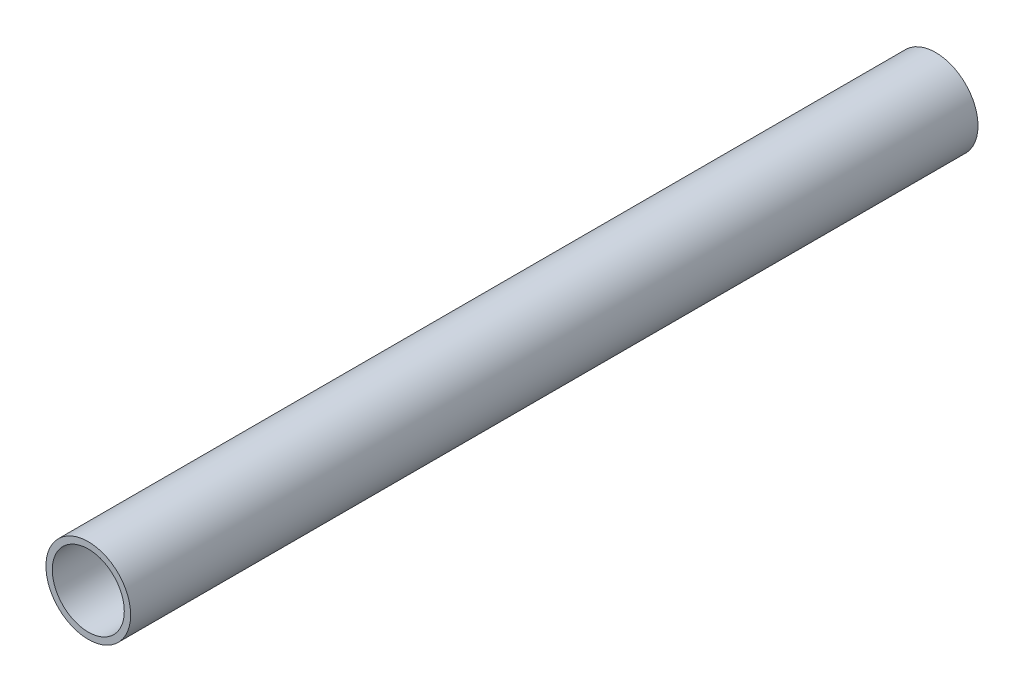
ISO-10303-21;
HEADER;
FILE_DESCRIPTION(('STEP AP214'),'2;1');
FILE_NAME('part.step','',(''),(''),'','','');
FILE_SCHEMA(('AUTOMOTIVE_DESIGN { 1 0 10303 214 1 1 1 1 }'));
ENDSEC;
DATA;
#1=APPLICATION_CONTEXT('core data for automotive mechanical design processes');
#2=APPLICATION_PROTOCOL_DEFINITION('international standard','automotive_design',2000,#1);
#3=PRODUCT_CONTEXT('',#1,'mechanical');
#4=PRODUCT('Part','Part','',(#3));
#5=PRODUCT_RELATED_PRODUCT_CATEGORY('part','',(#4));
#6=PRODUCT_DEFINITION_FORMATION('','',#4);
#7=PRODUCT_DEFINITION_CONTEXT('part definition',#1,'design');
#8=PRODUCT_DEFINITION('design','',#6,#7);
#9=PRODUCT_DEFINITION_SHAPE('','',#8);
#10=(LENGTH_UNIT() NAMED_UNIT(*) SI_UNIT(.MILLI.,.METRE.));
#11=(NAMED_UNIT(*) PLANE_ANGLE_UNIT() SI_UNIT($,.RADIAN.));
#12=(NAMED_UNIT(*) SI_UNIT($,.STERADIAN.) SOLID_ANGLE_UNIT());
#13=UNCERTAINTY_MEASURE_WITH_UNIT(LENGTH_MEASURE(1.E-05),#10,'distance_accuracy_value','');
#14=(GEOMETRIC_REPRESENTATION_CONTEXT(3) GLOBAL_UNCERTAINTY_ASSIGNED_CONTEXT((#13)) GLOBAL_UNIT_ASSIGNED_CONTEXT((#10,
#11,#12)) REPRESENTATION_CONTEXT('',''));
#15=CARTESIAN_POINT('',(0.,0.,0.));
#16=DIRECTION('',(0.,0.,1.));
#17=DIRECTION('',(1.,0.,0.));
#18=AXIS2_PLACEMENT_3D('',#15,#16,#17);
#19=CARTESIAN_POINT('',(0.,0.,200.));
#20=DIRECTION('',(0.,0.,1.));
#21=DIRECTION('',(1.,0.,0.));
#22=AXIS2_PLACEMENT_3D('',#19,#20,#21);
#23=PLANE('',#22);
#24=CARTESIAN_POINT('',(0.,0.,200.));
#25=DIRECTION('',(0.,0.,1.));
#26=DIRECTION('',(1.,0.,0.));
#27=AXIS2_PLACEMENT_3D('',#24,#25,#26);
#28=CIRCLE('',#27,10.);
#29=CARTESIAN_POINT('',(10.,0.,200.));
#30=VERTEX_POINT('',#29);
#31=EDGE_CURVE('E10',#30,#30,#28,.T.);
#32=ORIENTED_EDGE('',*,*,#31,.T.);
#33=EDGE_LOOP('',(#32));
#34=FACE_BOUND('',#33,.T.);
#35=CARTESIAN_POINT('',(0.,0.,200.));
#36=DIRECTION('',(0.,0.,1.));
#37=DIRECTION('',(1.,0.,0.));
#38=AXIS2_PLACEMENT_3D('',#35,#36,#37);
#39=CIRCLE('',#38,8.5);
#40=CARTESIAN_POINT('',(8.5,0.,200.));
#41=VERTEX_POINT('',#40);
#42=EDGE_CURVE('E50',#41,#41,#39,.T.);
#43=ORIENTED_EDGE('',*,*,#42,.F.);
#44=EDGE_LOOP('',(#43));
#45=FACE_BOUND('',#44,.T.);
#46=ADVANCED_FACE('F37',(#34,#45),#23,.T.);
#47=CARTESIAN_POINT('',(0.,0.,0.));
#48=DIRECTION('',(0.,0.,1.));
#49=DIRECTION('',(1.,0.,0.));
#50=AXIS2_PLACEMENT_3D('',#47,#48,#49);
#51=PLANE('',#50);
#52=CARTESIAN_POINT('',(0.,0.,0.));
#53=DIRECTION('',(0.,0.,1.));
#54=DIRECTION('',(1.,0.,0.));
#55=AXIS2_PLACEMENT_3D('',#52,#53,#54);
#56=CIRCLE('',#55,10.);
#57=CARTESIAN_POINT('',(10.,0.,0.));
#58=VERTEX_POINT('',#57);
#59=EDGE_CURVE('E41',#58,#58,#56,.T.);
#60=ORIENTED_EDGE('',*,*,#59,.F.);
#61=EDGE_LOOP('',(#60));
#62=FACE_BOUND('',#61,.T.);
#63=CARTESIAN_POINT('',(0.,0.,0.));
#64=DIRECTION('',(0.,0.,1.));
#65=DIRECTION('',(1.,0.,0.));
#66=AXIS2_PLACEMENT_3D('',#63,#64,#65);
#67=CIRCLE('',#66,8.5);
#68=CARTESIAN_POINT('',(8.5,0.,0.));
#69=VERTEX_POINT('',#68);
#70=EDGE_CURVE('E52',#69,#69,#67,.T.);
#71=ORIENTED_EDGE('',*,*,#70,.T.);
#72=EDGE_LOOP('',(#71));
#73=FACE_BOUND('',#72,.T.);
#74=ADVANCED_FACE('F64',(#62,#73),#51,.F.);
#75=CARTESIAN_POINT('',(0.,0.,200.));
#76=DIRECTION('',(0.,0.,-1.));
#77=DIRECTION('',(-1.,0.,0.));
#78=AXIS2_PLACEMENT_3D('',#75,#76,#77);
#79=CYLINDRICAL_SURFACE('',#78,10.);
#80=ORIENTED_EDGE('',*,*,#31,.F.);
#81=EDGE_LOOP('',(#80));
#82=FACE_BOUND('',#81,.T.);
#83=ORIENTED_EDGE('',*,*,#59,.T.);
#84=EDGE_LOOP('',(#83));
#85=FACE_BOUND('',#84,.T.);
#86=ADVANCED_FACE('F39',(#82,#85),#79,.T.);
#87=CARTESIAN_POINT('',(0.,0.,200.));
#88=DIRECTION('',(0.,0.,-1.));
#89=DIRECTION('',(-1.,0.,0.));
#90=AXIS2_PLACEMENT_3D('',#87,#88,#89);
#91=CYLINDRICAL_SURFACE('',#90,8.5);
#92=ORIENTED_EDGE('',*,*,#42,.T.);
#93=EDGE_LOOP('',(#92));
#94=FACE_BOUND('',#93,.T.);
#95=ORIENTED_EDGE('',*,*,#70,.F.);
#96=EDGE_LOOP('',(#95));
#97=FACE_BOUND('',#96,.T.);
#98=ADVANCED_FACE('F60',(#94,#97),#91,.F.);
#99=CLOSED_SHELL('',(#46,#74,#86,#98));
#100=MANIFOLD_SOLID_BREP('B2',#99);
#101=ADVANCED_BREP_SHAPE_REPRESENTATION('',(#18,#100),#14);
#102=SHAPE_DEFINITION_REPRESENTATION(#9,#101);
ENDSEC;
END-ISO-10303-21;
